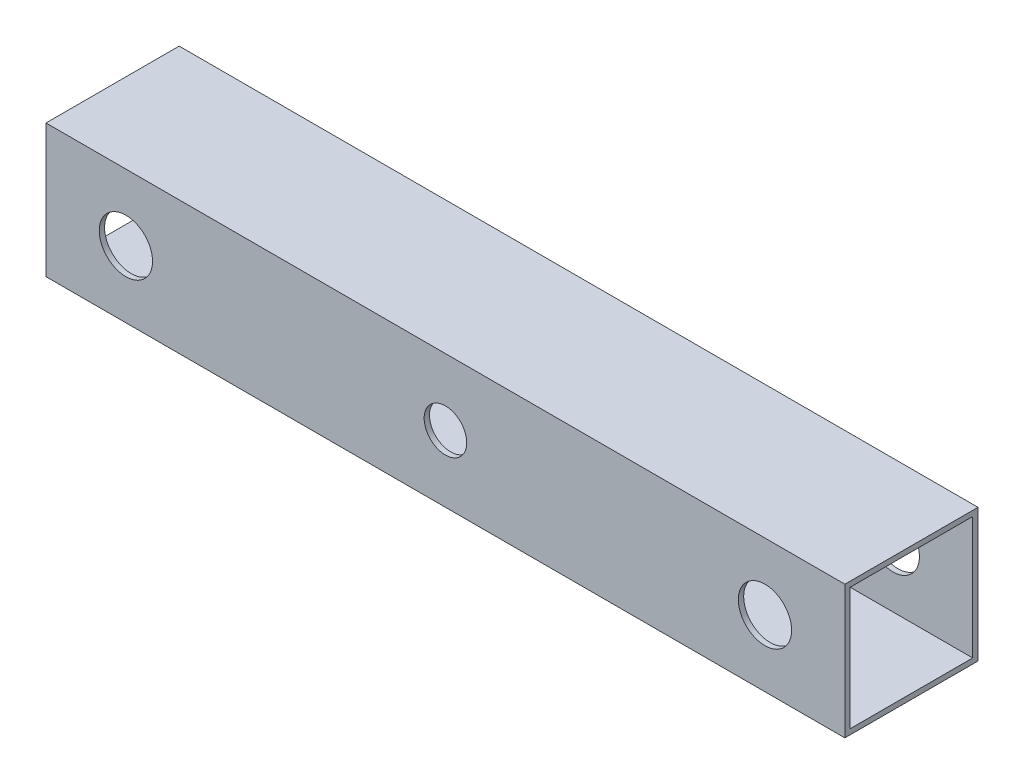
ISO-10303-21;
HEADER;
FILE_DESCRIPTION(('STEP AP214'),'2;1');
FILE_NAME('part.step','',(''),(''),'','','');
FILE_SCHEMA(('AUTOMOTIVE_DESIGN { 1 0 10303 214 1 1 1 1 }'));
ENDSEC;
DATA;
#1=APPLICATION_CONTEXT('core data for automotive mechanical design processes');
#2=APPLICATION_PROTOCOL_DEFINITION('international standard','automotive_design',2000,#1);
#3=PRODUCT_CONTEXT('',#1,'mechanical');
#4=PRODUCT('Part','Part','',(#3));
#5=PRODUCT_RELATED_PRODUCT_CATEGORY('part','',(#4));
#6=PRODUCT_DEFINITION_FORMATION('','',#4);
#7=PRODUCT_DEFINITION_CONTEXT('part definition',#1,'design');
#8=PRODUCT_DEFINITION('design','',#6,#7);
#9=PRODUCT_DEFINITION_SHAPE('','',#8);
#10=(LENGTH_UNIT() NAMED_UNIT(*) SI_UNIT(.MILLI.,.METRE.));
#11=(NAMED_UNIT(*) PLANE_ANGLE_UNIT() SI_UNIT($,.RADIAN.));
#12=(NAMED_UNIT(*) SI_UNIT($,.STERADIAN.) SOLID_ANGLE_UNIT());
#13=UNCERTAINTY_MEASURE_WITH_UNIT(LENGTH_MEASURE(1.E-05),#10,'distance_accuracy_value','');
#14=(GEOMETRIC_REPRESENTATION_CONTEXT(3) GLOBAL_UNCERTAINTY_ASSIGNED_CONTEXT((#13)) GLOBAL_UNIT_ASSIGNED_CONTEXT((#10,
#11,#12)) REPRESENTATION_CONTEXT('',''));
#15=CARTESIAN_POINT('',(0.,0.,0.));
#16=DIRECTION('',(0.,0.,1.));
#17=DIRECTION('',(1.,0.,0.));
#18=AXIS2_PLACEMENT_3D('',#15,#16,#17);
#19=CARTESIAN_POINT('',(150.,0.,0.));
#20=DIRECTION('',(-1.,0.,0.));
#21=DIRECTION('',(0.,0.,1.));
#22=AXIS2_PLACEMENT_3D('',#19,#20,#21);
#23=PLANE('',#22);
#24=DIRECTION('',(0.,-1.,0.));
#25=VECTOR('',#24,1.);
#26=CARTESIAN_POINT('',(150.,-12.5,12.5));
#27=LINE('',#26,#25);
#28=CARTESIAN_POINT('',(150.,12.5,12.5));
#29=VERTEX_POINT('',#28);
#30=CARTESIAN_POINT('',(150.,-12.5,12.5));
#31=VERTEX_POINT('',#30);
#32=EDGE_CURVE('E142',#29,#31,#27,.T.);
#33=ORIENTED_EDGE('',*,*,#32,.T.);
#34=DIRECTION('',(0.,0.,-1.));
#35=VECTOR('',#34,1.);
#36=CARTESIAN_POINT('',(150.,-12.5,12.5));
#37=LINE('',#36,#35);
#38=CARTESIAN_POINT('',(150.,-12.5,-12.5));
#39=VERTEX_POINT('',#38);
#40=EDGE_CURVE('E145',#31,#39,#37,.T.);
#41=ORIENTED_EDGE('',*,*,#40,.T.);
#42=DIRECTION('',(0.,1.,0.));
#43=VECTOR('',#42,1.);
#44=CARTESIAN_POINT('',(150.,-12.5,-12.5));
#45=LINE('',#44,#43);
#46=CARTESIAN_POINT('',(150.,12.5,-12.5));
#47=VERTEX_POINT('',#46);
#48=EDGE_CURVE('E148',#39,#47,#45,.T.);
#49=ORIENTED_EDGE('',*,*,#48,.T.);
#50=DIRECTION('',(0.,0.,1.));
#51=VECTOR('',#50,1.);
#52=CARTESIAN_POINT('',(150.,12.5,12.5));
#53=LINE('',#52,#51);
#54=EDGE_CURVE('E150',#47,#29,#53,.T.);
#55=ORIENTED_EDGE('',*,*,#54,.T.);
#56=EDGE_LOOP('',(#33,#41,#49,#55));
#57=FACE_BOUND('',#56,.T.);
#58=DIRECTION('',(0.,1.,0.));
#59=VECTOR('',#58,1.);
#60=CARTESIAN_POINT('',(150.,-11.5,-11.5));
#61=LINE('',#60,#59);
#62=CARTESIAN_POINT('',(150.,-11.5,-11.5));
#63=VERTEX_POINT('',#62);
#64=CARTESIAN_POINT('',(150.,11.5,-11.5));
#65=VERTEX_POINT('',#64);
#66=EDGE_CURVE('E104',#63,#65,#61,.T.);
#67=ORIENTED_EDGE('',*,*,#66,.F.);
#68=DIRECTION('',(0.,0.,-1.));
#69=VECTOR('',#68,1.);
#70=CARTESIAN_POINT('',(150.,-11.5,11.5));
#71=LINE('',#70,#69);
#72=CARTESIAN_POINT('',(150.,-11.5,11.5));
#73=VERTEX_POINT('',#72);
#74=EDGE_CURVE('E126',#73,#63,#71,.T.);
#75=ORIENTED_EDGE('',*,*,#74,.F.);
#76=DIRECTION('',(0.,-1.,0.));
#77=VECTOR('',#76,1.);
#78=CARTESIAN_POINT('',(150.,-11.5,11.5));
#79=LINE('',#78,#77);
#80=CARTESIAN_POINT('',(150.,11.5,11.5));
#81=VERTEX_POINT('',#80);
#82=EDGE_CURVE('E124',#81,#73,#79,.T.);
#83=ORIENTED_EDGE('',*,*,#82,.F.);
#84=DIRECTION('',(0.,0.,1.));
#85=VECTOR('',#84,1.);
#86=CARTESIAN_POINT('',(150.,11.5,11.5));
#87=LINE('',#86,#85);
#88=EDGE_CURVE('E112',#65,#81,#87,.T.);
#89=ORIENTED_EDGE('',*,*,#88,.F.);
#90=EDGE_LOOP('',(#67,#75,#83,#89));
#91=FACE_BOUND('',#90,.T.);
#92=ADVANCED_FACE('F37',(#57,#91),#23,.F.);
#93=CARTESIAN_POINT('',(0.,0.,0.));
#94=DIRECTION('',(-1.,0.,0.));
#95=DIRECTION('',(0.,0.,1.));
#96=AXIS2_PLACEMENT_3D('',#93,#94,#95);
#97=PLANE('',#96);
#98=DIRECTION('',(0.,-1.,0.));
#99=VECTOR('',#98,1.);
#100=CARTESIAN_POINT('',(0.,-12.5,12.5));
#101=LINE('',#100,#99);
#102=CARTESIAN_POINT('',(0.,12.5,12.5));
#103=VERTEX_POINT('',#102);
#104=CARTESIAN_POINT('',(0.,-12.5,12.5));
#105=VERTEX_POINT('',#104);
#106=EDGE_CURVE('E120',#103,#105,#101,.T.);
#107=ORIENTED_EDGE('',*,*,#106,.F.);
#108=DIRECTION('',(0.,0.,1.));
#109=VECTOR('',#108,1.);
#110=CARTESIAN_POINT('',(0.,12.5,12.5));
#111=LINE('',#110,#109);
#112=CARTESIAN_POINT('',(0.,12.5,-12.5));
#113=VERTEX_POINT('',#112);
#114=EDGE_CURVE('E146',#113,#103,#111,.T.);
#115=ORIENTED_EDGE('',*,*,#114,.F.);
#116=DIRECTION('',(0.,1.,0.));
#117=VECTOR('',#116,1.);
#118=CARTESIAN_POINT('',(0.,-12.5,-12.5));
#119=LINE('',#118,#117);
#120=CARTESIAN_POINT('',(0.,-12.5,-12.5));
#121=VERTEX_POINT('',#120);
#122=EDGE_CURVE('E157',#121,#113,#119,.T.);
#123=ORIENTED_EDGE('',*,*,#122,.F.);
#124=DIRECTION('',(0.,0.,-1.));
#125=VECTOR('',#124,1.);
#126=CARTESIAN_POINT('',(0.,-12.5,12.5));
#127=LINE('',#126,#125);
#128=EDGE_CURVE('E155',#105,#121,#127,.T.);
#129=ORIENTED_EDGE('',*,*,#128,.F.);
#130=EDGE_LOOP('',(#107,#115,#123,#129));
#131=FACE_BOUND('',#130,.T.);
#132=DIRECTION('',(0.,0.,-1.));
#133=VECTOR('',#132,1.);
#134=CARTESIAN_POINT('',(0.,-11.5,11.5));
#135=LINE('',#134,#133);
#136=CARTESIAN_POINT('',(0.,-11.5,11.5));
#137=VERTEX_POINT('',#136);
#138=CARTESIAN_POINT('',(0.,-11.5,-11.5));
#139=VERTEX_POINT('',#138);
#140=EDGE_CURVE('E113',#137,#139,#135,.T.);
#141=ORIENTED_EDGE('',*,*,#140,.T.);
#142=DIRECTION('',(0.,1.,0.));
#143=VECTOR('',#142,1.);
#144=CARTESIAN_POINT('',(0.,-11.5,-11.5));
#145=LINE('',#144,#143);
#146=CARTESIAN_POINT('',(0.,11.5,-11.5));
#147=VERTEX_POINT('',#146);
#148=EDGE_CURVE('E62',#139,#147,#145,.T.);
#149=ORIENTED_EDGE('',*,*,#148,.T.);
#150=DIRECTION('',(0.,0.,1.));
#151=VECTOR('',#150,1.);
#152=CARTESIAN_POINT('',(0.,11.5,11.5));
#153=LINE('',#152,#151);
#154=CARTESIAN_POINT('',(0.,11.5,11.5));
#155=VERTEX_POINT('',#154);
#156=EDGE_CURVE('E119',#147,#155,#153,.T.);
#157=ORIENTED_EDGE('',*,*,#156,.T.);
#158=DIRECTION('',(0.,-1.,0.));
#159=VECTOR('',#158,1.);
#160=CARTESIAN_POINT('',(0.,-11.5,11.5));
#161=LINE('',#160,#159);
#162=EDGE_CURVE('E134',#155,#137,#161,.T.);
#163=ORIENTED_EDGE('',*,*,#162,.T.);
#164=EDGE_LOOP('',(#141,#149,#157,#163));
#165=FACE_BOUND('',#164,.T.);
#166=ADVANCED_FACE('F204',(#131,#165),#97,.T.);
#167=CARTESIAN_POINT('',(150.,-12.5,12.5));
#168=DIRECTION('',(0.,0.,-1.));
#169=DIRECTION('',(-1.,0.,0.));
#170=AXIS2_PLACEMENT_3D('',#167,#168,#169);
#171=PLANE('',#170);
#172=CARTESIAN_POINT('',(135.,0.,12.5));
#173=DIRECTION('',(0.,0.,1.));
#174=DIRECTION('',(1.,0.,0.));
#175=AXIS2_PLACEMENT_3D('',#172,#173,#174);
#176=CIRCLE('',#175,4.99999999999999);
#177=CARTESIAN_POINT('',(140.,0.,12.5));
#178=VERTEX_POINT('',#177);
#179=EDGE_CURVE('E257',#178,#178,#176,.T.);
#180=ORIENTED_EDGE('',*,*,#179,.F.);
#181=EDGE_LOOP('',(#180));
#182=FACE_BOUND('',#181,.T.);
#183=CARTESIAN_POINT('',(15.,0.,12.5));
#184=DIRECTION('',(0.,0.,1.));
#185=DIRECTION('',(1.,0.,0.));
#186=AXIS2_PLACEMENT_3D('',#183,#184,#185);
#187=CIRCLE('',#186,5.);
#188=CARTESIAN_POINT('',(20.,0.,12.5));
#189=VERTEX_POINT('',#188);
#190=EDGE_CURVE('E261',#189,#189,#187,.T.);
#191=ORIENTED_EDGE('',*,*,#190,.F.);
#192=EDGE_LOOP('',(#191));
#193=FACE_BOUND('',#192,.T.);
#194=CARTESIAN_POINT('',(75.,0.,12.5));
#195=DIRECTION('',(0.,0.,1.));
#196=DIRECTION('',(1.,0.,0.));
#197=AXIS2_PLACEMENT_3D('',#194,#195,#196);
#198=CIRCLE('',#197,4.00000000000001);
#199=CARTESIAN_POINT('',(79.,0.,12.5));
#200=VERTEX_POINT('',#199);
#201=EDGE_CURVE('E183',#200,#200,#198,.T.);
#202=ORIENTED_EDGE('',*,*,#201,.F.);
#203=EDGE_LOOP('',(#202));
#204=FACE_BOUND('',#203,.T.);
#205=ORIENTED_EDGE('',*,*,#106,.T.);
#206=DIRECTION('',(-1.,0.,0.));
#207=VECTOR('',#206,1.);
#208=CARTESIAN_POINT('',(150.,-12.5,12.5));
#209=LINE('',#208,#207);
#210=EDGE_CURVE('E11',#31,#105,#209,.T.);
#211=ORIENTED_EDGE('',*,*,#210,.F.);
#212=ORIENTED_EDGE('',*,*,#32,.F.);
#213=DIRECTION('',(-1.,0.,0.));
#214=VECTOR('',#213,1.);
#215=CARTESIAN_POINT('',(150.,12.5,12.5));
#216=LINE('',#215,#214);
#217=EDGE_CURVE('E152',#29,#103,#216,.T.);
#218=ORIENTED_EDGE('',*,*,#217,.T.);
#219=EDGE_LOOP('',(#205,#211,#212,#218));
#220=FACE_BOUND('',#219,.T.);
#221=ADVANCED_FACE('F39',(#182,#193,#204,#220),#171,.F.);
#222=CARTESIAN_POINT('',(150.,-12.5,12.5));
#223=DIRECTION('',(0.,1.,0.));
#224=DIRECTION('',(0.,0.,1.));
#225=AXIS2_PLACEMENT_3D('',#222,#223,#224);
#226=PLANE('',#225);
#227=ORIENTED_EDGE('',*,*,#128,.T.);
#228=DIRECTION('',(-1.,0.,0.));
#229=VECTOR('',#228,1.);
#230=CARTESIAN_POINT('',(150.,-12.5,-12.5));
#231=LINE('',#230,#229);
#232=EDGE_CURVE('E46',#39,#121,#231,.T.);
#233=ORIENTED_EDGE('',*,*,#232,.F.);
#234=ORIENTED_EDGE('',*,*,#40,.F.);
#235=ORIENTED_EDGE('',*,*,#210,.T.);
#236=EDGE_LOOP('',(#227,#233,#234,#235));
#237=FACE_BOUND('',#236,.T.);
#238=ADVANCED_FACE('F232',(#237),#226,.F.);
#239=CARTESIAN_POINT('',(150.,-12.5,-12.5));
#240=DIRECTION('',(0.,0.,1.));
#241=DIRECTION('',(1.,0.,0.));
#242=AXIS2_PLACEMENT_3D('',#239,#240,#241);
#243=PLANE('',#242);
#244=CARTESIAN_POINT('',(135.,0.,-12.5));
#245=DIRECTION('',(0.,0.,1.));
#246=DIRECTION('',(1.,0.,0.));
#247=AXIS2_PLACEMENT_3D('',#244,#245,#246);
#248=CIRCLE('',#247,4.99999999999999);
#249=CARTESIAN_POINT('',(140.,0.,-12.5));
#250=VERTEX_POINT('',#249);
#251=EDGE_CURVE('E273',#250,#250,#248,.T.);
#252=ORIENTED_EDGE('',*,*,#251,.T.);
#253=EDGE_LOOP('',(#252));
#254=FACE_BOUND('',#253,.T.);
#255=CARTESIAN_POINT('',(15.,0.,-12.5));
#256=DIRECTION('',(0.,0.,1.));
#257=DIRECTION('',(1.,0.,0.));
#258=AXIS2_PLACEMENT_3D('',#255,#256,#257);
#259=CIRCLE('',#258,5.);
#260=CARTESIAN_POINT('',(20.,0.,-12.5));
#261=VERTEX_POINT('',#260);
#262=EDGE_CURVE('E266',#261,#261,#259,.T.);
#263=ORIENTED_EDGE('',*,*,#262,.T.);
#264=EDGE_LOOP('',(#263));
#265=FACE_BOUND('',#264,.T.);
#266=CARTESIAN_POINT('',(75.,0.,-12.5));
#267=DIRECTION('',(0.,0.,1.));
#268=DIRECTION('',(1.,0.,0.));
#269=AXIS2_PLACEMENT_3D('',#266,#267,#268);
#270=CIRCLE('',#269,4.00000000000001);
#271=CARTESIAN_POINT('',(79.,0.,-12.5));
#272=VERTEX_POINT('',#271);
#273=EDGE_CURVE('E170',#272,#272,#270,.T.);
#274=ORIENTED_EDGE('',*,*,#273,.T.);
#275=EDGE_LOOP('',(#274));
#276=FACE_BOUND('',#275,.T.);
#277=ORIENTED_EDGE('',*,*,#122,.T.);
#278=DIRECTION('',(-1.,0.,0.));
#279=VECTOR('',#278,1.);
#280=CARTESIAN_POINT('',(150.,12.5,-12.5));
#281=LINE('',#280,#279);
#282=EDGE_CURVE('E162',#47,#113,#281,.T.);
#283=ORIENTED_EDGE('',*,*,#282,.F.);
#284=ORIENTED_EDGE('',*,*,#48,.F.);
#285=ORIENTED_EDGE('',*,*,#232,.T.);
#286=EDGE_LOOP('',(#277,#283,#284,#285));
#287=FACE_BOUND('',#286,.T.);
#288=ADVANCED_FACE('F229',(#254,#265,#276,#287),#243,.F.);
#289=CARTESIAN_POINT('',(150.,12.5,12.5));
#290=DIRECTION('',(0.,-1.,0.));
#291=DIRECTION('',(0.,0.,-1.));
#292=AXIS2_PLACEMENT_3D('',#289,#290,#291);
#293=PLANE('',#292);
#294=ORIENTED_EDGE('',*,*,#114,.T.);
#295=ORIENTED_EDGE('',*,*,#217,.F.);
#296=ORIENTED_EDGE('',*,*,#54,.F.);
#297=ORIENTED_EDGE('',*,*,#282,.T.);
#298=EDGE_LOOP('',(#294,#295,#296,#297));
#299=FACE_BOUND('',#298,.T.);
#300=ADVANCED_FACE('F226',(#299),#293,.F.);
#301=CARTESIAN_POINT('',(150.,-11.5,-11.5));
#302=DIRECTION('',(0.,0.,1.));
#303=DIRECTION('',(0.,-1.,0.));
#304=AXIS2_PLACEMENT_3D('',#301,#302,#303);
#305=PLANE('',#304);
#306=CARTESIAN_POINT('',(135.,0.,-11.5));
#307=DIRECTION('',(0.,0.,1.));
#308=DIRECTION('',(0.,-1.,0.));
#309=AXIS2_PLACEMENT_3D('',#306,#307,#308);
#310=CIRCLE('',#309,4.99999999999999);
#311=CARTESIAN_POINT('',(135.,-4.99999999999999,-11.5));
#312=VERTEX_POINT('',#311);
#313=EDGE_CURVE('E132',#312,#312,#310,.T.);
#314=ORIENTED_EDGE('',*,*,#313,.F.);
#315=EDGE_LOOP('',(#314));
#316=FACE_BOUND('',#315,.T.);
#317=CARTESIAN_POINT('',(15.,0.,-11.5));
#318=DIRECTION('',(0.,0.,1.));
#319=DIRECTION('',(0.,-1.,0.));
#320=AXIS2_PLACEMENT_3D('',#317,#318,#319);
#321=CIRCLE('',#320,5.);
#322=CARTESIAN_POINT('',(15.,-5.,-11.5));
#323=VERTEX_POINT('',#322);
#324=EDGE_CURVE('E173',#323,#323,#321,.T.);
#325=ORIENTED_EDGE('',*,*,#324,.F.);
#326=EDGE_LOOP('',(#325));
#327=FACE_BOUND('',#326,.T.);
#328=CARTESIAN_POINT('',(75.,0.,-11.5));
#329=DIRECTION('',(0.,0.,1.));
#330=DIRECTION('',(0.,-1.,0.));
#331=AXIS2_PLACEMENT_3D('',#328,#329,#330);
#332=CIRCLE('',#331,4.00000000000001);
#333=CARTESIAN_POINT('',(75.,-4.00000000000001,-11.5));
#334=VERTEX_POINT('',#333);
#335=EDGE_CURVE('E169',#334,#334,#332,.T.);
#336=ORIENTED_EDGE('',*,*,#335,.F.);
#337=EDGE_LOOP('',(#336));
#338=FACE_BOUND('',#337,.T.);
#339=ORIENTED_EDGE('',*,*,#148,.F.);
#340=DIRECTION('',(-1.,0.,0.));
#341=VECTOR('',#340,1.);
#342=CARTESIAN_POINT('',(150.,-11.5,-11.5));
#343=LINE('',#342,#341);
#344=EDGE_CURVE('E108',#63,#139,#343,.T.);
#345=ORIENTED_EDGE('',*,*,#344,.F.);
#346=ORIENTED_EDGE('',*,*,#66,.T.);
#347=DIRECTION('',(-1.,0.,0.));
#348=VECTOR('',#347,1.);
#349=CARTESIAN_POINT('',(150.,11.5,-11.5));
#350=LINE('',#349,#348);
#351=EDGE_CURVE('E107',#65,#147,#350,.T.);
#352=ORIENTED_EDGE('',*,*,#351,.T.);
#353=EDGE_LOOP('',(#339,#345,#346,#352));
#354=FACE_BOUND('',#353,.T.);
#355=ADVANCED_FACE('F106',(#316,#327,#338,#354),#305,.T.);
#356=CARTESIAN_POINT('',(150.,11.5,11.5));
#357=DIRECTION('',(0.,-1.,0.));
#358=DIRECTION('',(0.,0.,-1.));
#359=AXIS2_PLACEMENT_3D('',#356,#357,#358);
#360=PLANE('',#359);
#361=ORIENTED_EDGE('',*,*,#156,.F.);
#362=ORIENTED_EDGE('',*,*,#351,.F.);
#363=ORIENTED_EDGE('',*,*,#88,.T.);
#364=DIRECTION('',(-1.,0.,0.));
#365=VECTOR('',#364,1.);
#366=CARTESIAN_POINT('',(150.,11.5,11.5));
#367=LINE('',#366,#365);
#368=EDGE_CURVE('E121',#81,#155,#367,.T.);
#369=ORIENTED_EDGE('',*,*,#368,.T.);
#370=EDGE_LOOP('',(#361,#362,#363,#369));
#371=FACE_BOUND('',#370,.T.);
#372=ADVANCED_FACE('F116',(#371),#360,.T.);
#373=CARTESIAN_POINT('',(150.,-11.5,11.5));
#374=DIRECTION('',(0.,0.,-1.));
#375=DIRECTION('',(-1.,0.,0.));
#376=AXIS2_PLACEMENT_3D('',#373,#374,#375);
#377=PLANE('',#376);
#378=CARTESIAN_POINT('',(135.,0.,11.5));
#379=DIRECTION('',(0.,0.,-1.));
#380=DIRECTION('',(-1.,0.,0.));
#381=AXIS2_PLACEMENT_3D('',#378,#379,#380);
#382=CIRCLE('',#381,4.99999999999999);
#383=CARTESIAN_POINT('',(130.,0.,11.5));
#384=VERTEX_POINT('',#383);
#385=EDGE_CURVE('E41',#384,#384,#382,.T.);
#386=ORIENTED_EDGE('',*,*,#385,.F.);
#387=EDGE_LOOP('',(#386));
#388=FACE_BOUND('',#387,.T.);
#389=CARTESIAN_POINT('',(15.,0.,11.5));
#390=DIRECTION('',(0.,0.,-1.));
#391=DIRECTION('',(-1.,0.,0.));
#392=AXIS2_PLACEMENT_3D('',#389,#390,#391);
#393=CIRCLE('',#392,5.);
#394=CARTESIAN_POINT('',(10.,0.,11.5));
#395=VERTEX_POINT('',#394);
#396=EDGE_CURVE('E171',#395,#395,#393,.T.);
#397=ORIENTED_EDGE('',*,*,#396,.F.);
#398=EDGE_LOOP('',(#397));
#399=FACE_BOUND('',#398,.T.);
#400=CARTESIAN_POINT('',(75.,0.,11.5));
#401=DIRECTION('',(0.,0.,-1.));
#402=DIRECTION('',(-1.,0.,0.));
#403=AXIS2_PLACEMENT_3D('',#400,#401,#402);
#404=CIRCLE('',#403,4.00000000000001);
#405=CARTESIAN_POINT('',(71.,0.,11.5));
#406=VERTEX_POINT('',#405);
#407=EDGE_CURVE('E167',#406,#406,#404,.T.);
#408=ORIENTED_EDGE('',*,*,#407,.F.);
#409=EDGE_LOOP('',(#408));
#410=FACE_BOUND('',#409,.T.);
#411=ORIENTED_EDGE('',*,*,#162,.F.);
#412=ORIENTED_EDGE('',*,*,#368,.F.);
#413=ORIENTED_EDGE('',*,*,#82,.T.);
#414=DIRECTION('',(-1.,0.,0.));
#415=VECTOR('',#414,1.);
#416=CARTESIAN_POINT('',(150.,-11.5,11.5));
#417=LINE('',#416,#415);
#418=EDGE_CURVE('E54',#73,#137,#417,.T.);
#419=ORIENTED_EDGE('',*,*,#418,.T.);
#420=EDGE_LOOP('',(#411,#412,#413,#419));
#421=FACE_BOUND('',#420,.T.);
#422=ADVANCED_FACE('F194',(#388,#399,#410,#421),#377,.T.);
#423=CARTESIAN_POINT('',(150.,-11.5,11.5));
#424=DIRECTION('',(0.,1.,0.));
#425=DIRECTION('',(0.,0.,1.));
#426=AXIS2_PLACEMENT_3D('',#423,#424,#425);
#427=PLANE('',#426);
#428=ORIENTED_EDGE('',*,*,#140,.F.);
#429=ORIENTED_EDGE('',*,*,#418,.F.);
#430=ORIENTED_EDGE('',*,*,#74,.T.);
#431=ORIENTED_EDGE('',*,*,#344,.T.);
#432=EDGE_LOOP('',(#428,#429,#430,#431));
#433=FACE_BOUND('',#432,.T.);
#434=ADVANCED_FACE('F197',(#433),#427,.T.);
#435=CARTESIAN_POINT('',(75.,0.,-12.5));
#436=DIRECTION('',(0.,0.,1.));
#437=DIRECTION('',(1.,0.,0.));
#438=AXIS2_PLACEMENT_3D('',#435,#436,#437);
#439=CYLINDRICAL_SURFACE('',#438,4.00000000000001);
#440=ORIENTED_EDGE('',*,*,#407,.T.);
#441=EDGE_LOOP('',(#440));
#442=FACE_BOUND('',#441,.T.);
#443=ORIENTED_EDGE('',*,*,#201,.T.);
#444=EDGE_LOOP('',(#443));
#445=FACE_BOUND('',#444,.T.);
#446=ADVANCED_FACE('F206',(#442,#445),#439,.F.);
#447=CARTESIAN_POINT('',(15.,0.,-12.5));
#448=DIRECTION('',(0.,0.,1.));
#449=DIRECTION('',(1.,0.,0.));
#450=AXIS2_PLACEMENT_3D('',#447,#448,#449);
#451=CYLINDRICAL_SURFACE('',#450,5.);
#452=ORIENTED_EDGE('',*,*,#396,.T.);
#453=EDGE_LOOP('',(#452));
#454=FACE_BOUND('',#453,.T.);
#455=ORIENTED_EDGE('',*,*,#190,.T.);
#456=EDGE_LOOP('',(#455));
#457=FACE_BOUND('',#456,.T.);
#458=ADVANCED_FACE('F211',(#454,#457),#451,.F.);
#459=CARTESIAN_POINT('',(135.,0.,-12.5));
#460=DIRECTION('',(0.,0.,1.));
#461=DIRECTION('',(1.,0.,0.));
#462=AXIS2_PLACEMENT_3D('',#459,#460,#461);
#463=CYLINDRICAL_SURFACE('',#462,4.99999999999999);
#464=ORIENTED_EDGE('',*,*,#385,.T.);
#465=EDGE_LOOP('',(#464));
#466=FACE_BOUND('',#465,.T.);
#467=ORIENTED_EDGE('',*,*,#179,.T.);
#468=EDGE_LOOP('',(#467));
#469=FACE_BOUND('',#468,.T.);
#470=ADVANCED_FACE('F191',(#466,#469),#463,.F.);
#471=ORIENTED_EDGE('',*,*,#335,.T.);
#472=EDGE_LOOP('',(#471));
#473=FACE_BOUND('',#472,.T.);
#474=ORIENTED_EDGE('',*,*,#273,.F.);
#475=EDGE_LOOP('',(#474));
#476=FACE_BOUND('',#475,.T.);
#477=ADVANCED_FACE('F214',(#473,#476),#439,.F.);
#478=ORIENTED_EDGE('',*,*,#324,.T.);
#479=EDGE_LOOP('',(#478));
#480=FACE_BOUND('',#479,.T.);
#481=ORIENTED_EDGE('',*,*,#262,.F.);
#482=EDGE_LOOP('',(#481));
#483=FACE_BOUND('',#482,.T.);
#484=ADVANCED_FACE('F280',(#480,#483),#451,.F.);
#485=ORIENTED_EDGE('',*,*,#313,.T.);
#486=EDGE_LOOP('',(#485));
#487=FACE_BOUND('',#486,.T.);
#488=ORIENTED_EDGE('',*,*,#251,.F.);
#489=EDGE_LOOP('',(#488));
#490=FACE_BOUND('',#489,.T.);
#491=ADVANCED_FACE('F278',(#487,#490),#463,.F.);
#492=CLOSED_SHELL('',(#92,#166,#221,#238,#288,#300,#355,#372,#422,#434,#446,#458,#470,#477,#484,#491));
#493=MANIFOLD_SOLID_BREP('B2',#492);
#494=ADVANCED_BREP_SHAPE_REPRESENTATION('',(#18,#493),#14);
#495=SHAPE_DEFINITION_REPRESENTATION(#9,#494);
ENDSEC;
END-ISO-10303-21;
